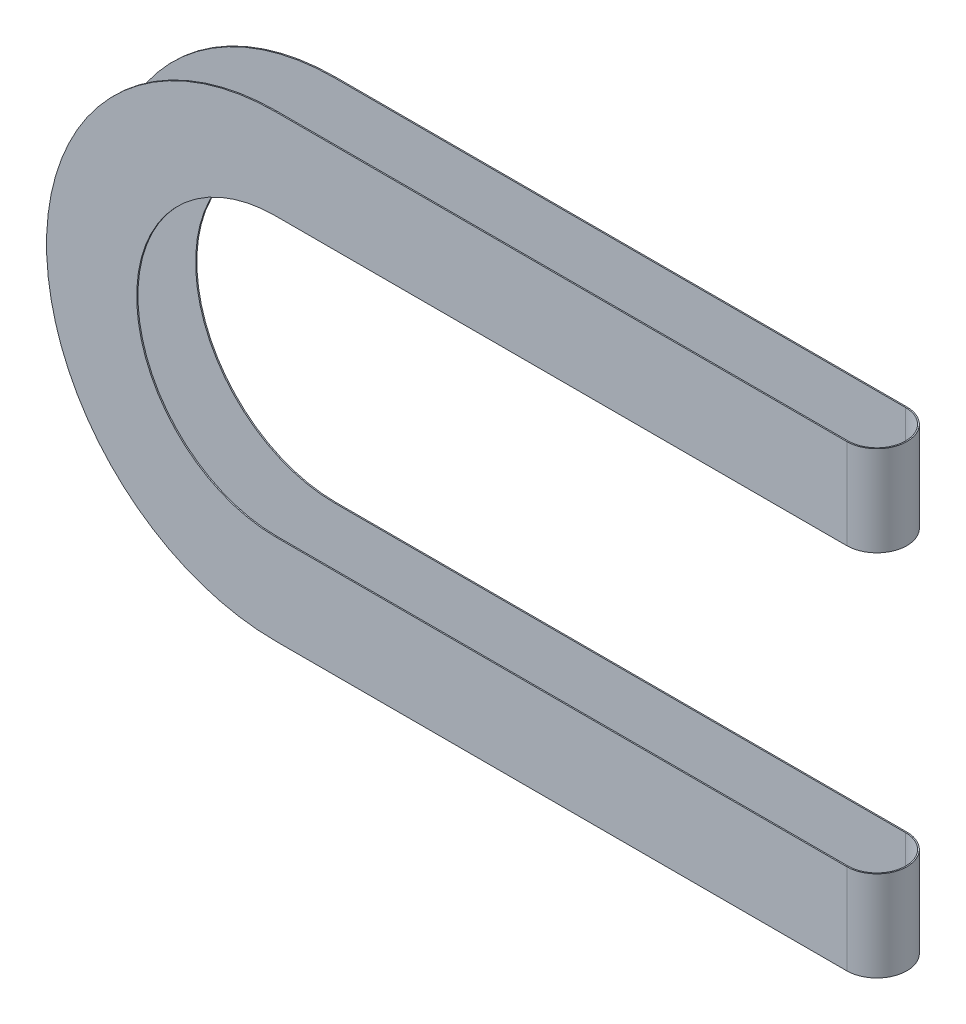
ISO-10303-21;
HEADER;
FILE_DESCRIPTION(('STEP AP214'),'2;1');
FILE_NAME('part.step','',(''),(''),'','','');
FILE_SCHEMA(('AUTOMOTIVE_DESIGN { 1 0 10303 214 1 1 1 1 }'));
ENDSEC;
DATA;
#1=APPLICATION_CONTEXT('core data for automotive mechanical design processes');
#2=APPLICATION_PROTOCOL_DEFINITION('international standard','automotive_design',2000,#1);
#3=PRODUCT_CONTEXT('',#1,'mechanical');
#4=PRODUCT('Part','Part','',(#3));
#5=PRODUCT_RELATED_PRODUCT_CATEGORY('part','',(#4));
#6=PRODUCT_DEFINITION_FORMATION('','',#4);
#7=PRODUCT_DEFINITION_CONTEXT('part definition',#1,'design');
#8=PRODUCT_DEFINITION('design','',#6,#7);
#9=PRODUCT_DEFINITION_SHAPE('','',#8);
#10=(LENGTH_UNIT() NAMED_UNIT(*) SI_UNIT(.MILLI.,.METRE.));
#11=(NAMED_UNIT(*) PLANE_ANGLE_UNIT() SI_UNIT($,.RADIAN.));
#12=(NAMED_UNIT(*) SI_UNIT($,.STERADIAN.) SOLID_ANGLE_UNIT());
#13=UNCERTAINTY_MEASURE_WITH_UNIT(LENGTH_MEASURE(1.E-05),#10,'distance_accuracy_value','');
#14=(GEOMETRIC_REPRESENTATION_CONTEXT(3) GLOBAL_UNCERTAINTY_ASSIGNED_CONTEXT((#13)) GLOBAL_UNIT_ASSIGNED_CONTEXT((#10,
#11,#12)) REPRESENTATION_CONTEXT('',''));
#15=CARTESIAN_POINT('',(0.,0.,0.));
#16=DIRECTION('',(0.,0.,1.));
#17=DIRECTION('',(1.,0.,0.));
#18=AXIS2_PLACEMENT_3D('',#15,#16,#17);
#19=CARTESIAN_POINT('',(0.,-381.25,100.));
#20=DIRECTION('',(0.,1.,0.));
#21=DIRECTION('',(-1.,0.,0.));
#22=AXIS2_PLACEMENT_3D('',#19,#20,#21);
#23=PLANE('',#22);
#24=DIRECTION('',(1.,0.,0.));
#25=VECTOR('',#24,1.);
#26=CARTESIAN_POINT('',(0.,-381.25,0.));
#27=LINE('',#26,#25);
#28=CARTESIAN_POINT('',(0.,-381.25,0.));
#29=VERTEX_POINT('',#28);
#30=CARTESIAN_POINT('',(950.,-381.25,0.));
#31=VERTEX_POINT('',#30);
#32=EDGE_CURVE('E231',#29,#31,#27,.T.);
#33=ORIENTED_EDGE('',*,*,#32,.T.);
#34=CARTESIAN_POINT('',(950.,-381.25,50.0000000000004));
#35=DIRECTION('',(0.,-1.,0.));
#36=DIRECTION('',(1.,0.,0.));
#37=AXIS2_PLACEMENT_3D('',#34,#35,#36);
#38=CIRCLE('',#37,50.);
#39=CARTESIAN_POINT('',(950.,-381.25,100.));
#40=VERTEX_POINT('',#39);
#41=EDGE_CURVE('E214',#31,#40,#38,.T.);
#42=ORIENTED_EDGE('',*,*,#41,.T.);
#43=DIRECTION('',(1.,0.,0.));
#44=VECTOR('',#43,1.);
#45=CARTESIAN_POINT('',(0.,-381.25,100.));
#46=LINE('',#45,#44);
#47=CARTESIAN_POINT('',(0.,-381.25,100.));
#48=VERTEX_POINT('',#47);
#49=EDGE_CURVE('E259',#48,#40,#46,.T.);
#50=ORIENTED_EDGE('',*,*,#49,.F.);
#51=DIRECTION('',(0.,0.,-1.));
#52=VECTOR('',#51,1.);
#53=CARTESIAN_POINT('',(0.,-381.25,100.));
#54=LINE('',#53,#52);
#55=CARTESIAN_POINT('',(0.,-381.25,98.0000000000003));
#56=VERTEX_POINT('',#55);
#57=EDGE_CURVE('E260',#48,#56,#54,.T.);
#58=ORIENTED_EDGE('',*,*,#57,.T.);
#59=DIRECTION('',(1.,0.,0.));
#60=VECTOR('',#59,1.);
#61=CARTESIAN_POINT('',(0.,-381.25,98.0000000000003));
#62=LINE('',#61,#60);
#63=CARTESIAN_POINT('',(950.,-381.25,98.0000000000008));
#64=VERTEX_POINT('',#63);
#65=EDGE_CURVE('E349',#56,#64,#62,.T.);
#66=ORIENTED_EDGE('',*,*,#65,.T.);
#67=CARTESIAN_POINT('',(950.,-381.25,50.0000000000004));
#68=DIRECTION('',(0.,-1.,0.));
#69=DIRECTION('',(1.,0.,0.));
#70=AXIS2_PLACEMENT_3D('',#67,#68,#69);
#71=CIRCLE('',#70,48.);
#72=CARTESIAN_POINT('',(950.,-381.25,2.));
#73=VERTEX_POINT('',#72);
#74=EDGE_CURVE('E353',#73,#64,#71,.T.);
#75=ORIENTED_EDGE('',*,*,#74,.F.);
#76=DIRECTION('',(1.,0.,0.));
#77=VECTOR('',#76,1.);
#78=CARTESIAN_POINT('',(0.,-381.25,2.));
#79=LINE('',#78,#77);
#80=CARTESIAN_POINT('',(0.,-381.25,2.));
#81=VERTEX_POINT('',#80);
#82=EDGE_CURVE('E224',#81,#73,#79,.T.);
#83=ORIENTED_EDGE('',*,*,#82,.F.);
#84=EDGE_CURVE('E239',#81,#29,#54,.T.);
#85=ORIENTED_EDGE('',*,*,#84,.T.);
#86=EDGE_LOOP('',(#33,#42,#50,#58,#66,#75,#83,#85));
#87=FACE_BOUND('',#86,.T.);
#88=ADVANCED_FACE('F102',(#87),#23,.F.);
#89=CARTESIAN_POINT('',(0.,-231.25,100.));
#90=DIRECTION('',(0.,1.,0.));
#91=DIRECTION('',(-1.,0.,0.));
#92=AXIS2_PLACEMENT_3D('',#89,#90,#91);
#93=PLANE('',#92);
#94=CARTESIAN_POINT('',(950.,-231.25,50.0000000000004));
#95=DIRECTION('',(0.,1.,0.));
#96=DIRECTION('',(-1.,0.,0.));
#97=AXIS2_PLACEMENT_3D('',#94,#95,#96);
#98=CIRCLE('',#97,50.);
#99=CARTESIAN_POINT('',(950.,-231.25,100.));
#100=VERTEX_POINT('',#99);
#101=CARTESIAN_POINT('',(950.,-231.25,0.));
#102=VERTEX_POINT('',#101);
#103=EDGE_CURVE('E300',#100,#102,#98,.T.);
#104=ORIENTED_EDGE('',*,*,#103,.T.);
#105=DIRECTION('',(1.,0.,0.));
#106=VECTOR('',#105,1.);
#107=CARTESIAN_POINT('',(0.,-231.25,0.));
#108=LINE('',#107,#106);
#109=CARTESIAN_POINT('',(0.,-231.25,0.));
#110=VERTEX_POINT('',#109);
#111=EDGE_CURVE('E235',#110,#102,#108,.T.);
#112=ORIENTED_EDGE('',*,*,#111,.F.);
#113=DIRECTION('',(0.,0.,-1.));
#114=VECTOR('',#113,1.);
#115=CARTESIAN_POINT('',(0.,-231.25,100.));
#116=LINE('',#115,#114);
#117=CARTESIAN_POINT('',(0.,-231.25,2.));
#118=VERTEX_POINT('',#117);
#119=EDGE_CURVE('E271',#118,#110,#116,.T.);
#120=ORIENTED_EDGE('',*,*,#119,.F.);
#121=DIRECTION('',(-1.,0.,0.));
#122=VECTOR('',#121,1.);
#123=CARTESIAN_POINT('',(0.,-231.25,2.));
#124=LINE('',#123,#122);
#125=CARTESIAN_POINT('',(950.,-231.25,2.));
#126=VERTEX_POINT('',#125);
#127=EDGE_CURVE('E308',#126,#118,#124,.T.);
#128=ORIENTED_EDGE('',*,*,#127,.F.);
#129=CARTESIAN_POINT('',(950.,-231.25,50.0000000000004));
#130=DIRECTION('',(0.,1.,0.));
#131=DIRECTION('',(-1.,0.,0.));
#132=AXIS2_PLACEMENT_3D('',#129,#130,#131);
#133=CIRCLE('',#132,48.);
#134=CARTESIAN_POINT('',(950.,-231.25,98.0000000000008));
#135=VERTEX_POINT('',#134);
#136=EDGE_CURVE('E240',#135,#126,#133,.T.);
#137=ORIENTED_EDGE('',*,*,#136,.F.);
#138=DIRECTION('',(-1.,0.,0.));
#139=VECTOR('',#138,1.);
#140=CARTESIAN_POINT('',(0.,-231.25,98.0000000000003));
#141=LINE('',#140,#139);
#142=CARTESIAN_POINT('',(0.,-231.25,98.0000000000003));
#143=VERTEX_POINT('',#142);
#144=EDGE_CURVE('E316',#135,#143,#141,.T.);
#145=ORIENTED_EDGE('',*,*,#144,.T.);
#146=CARTESIAN_POINT('',(0.,-231.25,100.));
#147=VERTEX_POINT('',#146);
#148=EDGE_CURVE('E272',#147,#143,#116,.T.);
#149=ORIENTED_EDGE('',*,*,#148,.F.);
#150=DIRECTION('',(1.,0.,0.));
#151=VECTOR('',#150,1.);
#152=CARTESIAN_POINT('',(0.,-231.25,100.));
#153=LINE('',#152,#151);
#154=EDGE_CURVE('E321',#147,#100,#153,.T.);
#155=ORIENTED_EDGE('',*,*,#154,.T.);
#156=EDGE_LOOP('',(#104,#112,#120,#128,#137,#145,#149,#155));
#157=FACE_BOUND('',#156,.T.);
#158=ADVANCED_FACE('F365',(#157),#93,.T.);
#159=CARTESIAN_POINT('',(0.,231.25,100.));
#160=DIRECTION('',(0.,1.,0.));
#161=DIRECTION('',(-1.,0.,0.));
#162=AXIS2_PLACEMENT_3D('',#159,#160,#161);
#163=PLANE('',#162);
#164=DIRECTION('',(1.,0.,0.));
#165=VECTOR('',#164,1.);
#166=CARTESIAN_POINT('',(0.,231.25,0.));
#167=LINE('',#166,#165);
#168=CARTESIAN_POINT('',(0.,231.25,0.));
#169=VERTEX_POINT('',#168);
#170=CARTESIAN_POINT('',(950.,231.25,0.));
#171=VERTEX_POINT('',#170);
#172=EDGE_CURVE('E252',#169,#171,#167,.T.);
#173=ORIENTED_EDGE('',*,*,#172,.T.);
#174=CARTESIAN_POINT('',(950.,231.25,50.0000000000004));
#175=DIRECTION('',(0.,1.,0.));
#176=DIRECTION('',(-1.,0.,0.));
#177=AXIS2_PLACEMENT_3D('',#174,#175,#176);
#178=CIRCLE('',#177,50.);
#179=CARTESIAN_POINT('',(950.,231.25,100.));
#180=VERTEX_POINT('',#179);
#181=EDGE_CURVE('E303',#180,#171,#178,.T.);
#182=ORIENTED_EDGE('',*,*,#181,.F.);
#183=DIRECTION('',(1.,0.,0.));
#184=VECTOR('',#183,1.);
#185=CARTESIAN_POINT('',(0.,231.25,100.));
#186=LINE('',#185,#184);
#187=CARTESIAN_POINT('',(0.,231.25,100.));
#188=VERTEX_POINT('',#187);
#189=EDGE_CURVE('E326',#188,#180,#186,.T.);
#190=ORIENTED_EDGE('',*,*,#189,.F.);
#191=DIRECTION('',(0.,0.,-1.));
#192=VECTOR('',#191,1.);
#193=CARTESIAN_POINT('',(0.,231.25,100.));
#194=LINE('',#193,#192);
#195=CARTESIAN_POINT('',(0.,231.25,98.0000000000003));
#196=VERTEX_POINT('',#195);
#197=EDGE_CURVE('E268',#188,#196,#194,.T.);
#198=ORIENTED_EDGE('',*,*,#197,.T.);
#199=DIRECTION('',(-1.,0.,0.));
#200=VECTOR('',#199,1.);
#201=CARTESIAN_POINT('',(0.,231.25,98.0000000000003));
#202=LINE('',#201,#200);
#203=CARTESIAN_POINT('',(950.,231.25,98.0000000000008));
#204=VERTEX_POINT('',#203);
#205=EDGE_CURVE('E312',#204,#196,#202,.T.);
#206=ORIENTED_EDGE('',*,*,#205,.F.);
#207=CARTESIAN_POINT('',(950.,231.25,50.0000000000004));
#208=DIRECTION('',(0.,1.,0.));
#209=DIRECTION('',(-1.,0.,0.));
#210=AXIS2_PLACEMENT_3D('',#207,#208,#209);
#211=CIRCLE('',#210,48.);
#212=CARTESIAN_POINT('',(950.,231.25,2.));
#213=VERTEX_POINT('',#212);
#214=EDGE_CURVE('E244',#204,#213,#211,.T.);
#215=ORIENTED_EDGE('',*,*,#214,.T.);
#216=DIRECTION('',(-1.,0.,0.));
#217=VECTOR('',#216,1.);
#218=CARTESIAN_POINT('',(0.,231.25,2.));
#219=LINE('',#218,#217);
#220=CARTESIAN_POINT('',(0.,231.25,2.));
#221=VERTEX_POINT('',#220);
#222=EDGE_CURVE('E293',#213,#221,#219,.T.);
#223=ORIENTED_EDGE('',*,*,#222,.T.);
#224=EDGE_CURVE('E267',#221,#169,#194,.T.);
#225=ORIENTED_EDGE('',*,*,#224,.T.);
#226=EDGE_LOOP('',(#173,#182,#190,#198,#206,#215,#223,#225));
#227=FACE_BOUND('',#226,.T.);
#228=ADVANCED_FACE('F345',(#227),#163,.F.);
#229=CARTESIAN_POINT('',(0.,381.25,100.));
#230=DIRECTION('',(0.,1.,0.));
#231=DIRECTION('',(-1.,0.,0.));
#232=AXIS2_PLACEMENT_3D('',#229,#230,#231);
#233=PLANE('',#232);
#234=CARTESIAN_POINT('',(950.,381.25,50.0000000000004));
#235=DIRECTION('',(0.,1.,0.));
#236=DIRECTION('',(-1.,0.,0.));
#237=AXIS2_PLACEMENT_3D('',#234,#235,#236);
#238=CIRCLE('',#237,50.);
#239=CARTESIAN_POINT('',(950.,381.25,100.));
#240=VERTEX_POINT('',#239);
#241=CARTESIAN_POINT('',(950.,381.25,0.));
#242=VERTEX_POINT('',#241);
#243=EDGE_CURVE('E343',#240,#242,#238,.T.);
#244=ORIENTED_EDGE('',*,*,#243,.T.);
#245=DIRECTION('',(1.,0.,0.));
#246=VECTOR('',#245,1.);
#247=CARTESIAN_POINT('',(0.,381.25,0.));
#248=LINE('',#247,#246);
#249=CARTESIAN_POINT('',(0.,381.25,0.));
#250=VERTEX_POINT('',#249);
#251=EDGE_CURVE('E255',#250,#242,#248,.T.);
#252=ORIENTED_EDGE('',*,*,#251,.F.);
#253=DIRECTION('',(0.,0.,-1.));
#254=VECTOR('',#253,1.);
#255=CARTESIAN_POINT('',(0.,381.25,100.));
#256=LINE('',#255,#254);
#257=CARTESIAN_POINT('',(0.,381.25,2.));
#258=VERTEX_POINT('',#257);
#259=EDGE_CURVE('E263',#258,#250,#256,.T.);
#260=ORIENTED_EDGE('',*,*,#259,.F.);
#261=DIRECTION('',(-1.,0.,0.));
#262=VECTOR('',#261,1.);
#263=CARTESIAN_POINT('',(0.,381.25,2.));
#264=LINE('',#263,#262);
#265=CARTESIAN_POINT('',(950.,381.25,2.));
#266=VERTEX_POINT('',#265);
#267=EDGE_CURVE('E123',#266,#258,#264,.T.);
#268=ORIENTED_EDGE('',*,*,#267,.F.);
#269=CARTESIAN_POINT('',(950.,381.25,50.0000000000004));
#270=DIRECTION('',(0.,1.,0.));
#271=DIRECTION('',(-1.,0.,0.));
#272=AXIS2_PLACEMENT_3D('',#269,#270,#271);
#273=CIRCLE('',#272,48.);
#274=CARTESIAN_POINT('',(950.,381.25,98.0000000000008));
#275=VERTEX_POINT('',#274);
#276=EDGE_CURVE('E236',#275,#266,#273,.T.);
#277=ORIENTED_EDGE('',*,*,#276,.F.);
#278=DIRECTION('',(-1.,0.,0.));
#279=VECTOR('',#278,1.);
#280=CARTESIAN_POINT('',(0.,381.25,98.0000000000003));
#281=LINE('',#280,#279);
#282=CARTESIAN_POINT('',(0.,381.25,98.0000000000003));
#283=VERTEX_POINT('',#282);
#284=EDGE_CURVE('E310',#275,#283,#281,.T.);
#285=ORIENTED_EDGE('',*,*,#284,.T.);
#286=CARTESIAN_POINT('',(0.,381.25,100.));
#287=VERTEX_POINT('',#286);
#288=EDGE_CURVE('E264',#287,#283,#256,.T.);
#289=ORIENTED_EDGE('',*,*,#288,.F.);
#290=DIRECTION('',(1.,0.,0.));
#291=VECTOR('',#290,1.);
#292=CARTESIAN_POINT('',(0.,381.25,100.));
#293=LINE('',#292,#291);
#294=EDGE_CURVE('E328',#287,#240,#293,.T.);
#295=ORIENTED_EDGE('',*,*,#294,.T.);
#296=EDGE_LOOP('',(#244,#252,#260,#268,#277,#285,#289,#295));
#297=FACE_BOUND('',#296,.T.);
#298=ADVANCED_FACE('F298',(#297),#233,.T.);
#299=CARTESIAN_POINT('',(0.,0.,100.));
#300=DIRECTION('',(0.,0.,-1.));
#301=DIRECTION('',(-1.,0.,0.));
#302=AXIS2_PLACEMENT_3D('',#299,#300,#301);
#303=CYLINDRICAL_SURFACE('',#302,231.25);
#304=CARTESIAN_POINT('',(0.,0.,98.0000000000003));
#305=DIRECTION('',(0.,0.,-1.));
#306=DIRECTION('',(-1.,0.,0.));
#307=AXIS2_PLACEMENT_3D('',#304,#305,#306);
#308=CIRCLE('',#307,231.25);
#309=EDGE_CURVE('E314',#196,#143,#308,.F.);
#310=ORIENTED_EDGE('',*,*,#309,.F.);
#311=ORIENTED_EDGE('',*,*,#197,.F.);
#312=CARTESIAN_POINT('',(0.,0.,100.));
#313=DIRECTION('',(0.,0.,1.));
#314=DIRECTION('',(1.,0.,0.));
#315=AXIS2_PLACEMENT_3D('',#312,#313,#314);
#316=CIRCLE('',#315,231.25);
#317=EDGE_CURVE('E324',#147,#188,#316,.F.);
#318=ORIENTED_EDGE('',*,*,#317,.F.);
#319=ORIENTED_EDGE('',*,*,#148,.T.);
#320=EDGE_LOOP('',(#310,#311,#318,#319));
#321=FACE_BOUND('',#320,.T.);
#322=ADVANCED_FACE('F376',(#321),#303,.F.);
#323=CARTESIAN_POINT('',(0.,0.,100.));
#324=DIRECTION('',(0.,0.,-1.));
#325=DIRECTION('',(-1.,0.,0.));
#326=AXIS2_PLACEMENT_3D('',#323,#324,#325);
#327=CYLINDRICAL_SURFACE('',#326,381.25);
#328=ORIENTED_EDGE('',*,*,#288,.T.);
#329=CARTESIAN_POINT('',(0.,0.,98.0000000000003));
#330=DIRECTION('',(0.,0.,-1.));
#331=DIRECTION('',(-1.,0.,0.));
#332=AXIS2_PLACEMENT_3D('',#329,#330,#331);
#333=CIRCLE('',#332,381.25);
#334=EDGE_CURVE('E279',#283,#56,#333,.F.);
#335=ORIENTED_EDGE('',*,*,#334,.T.);
#336=ORIENTED_EDGE('',*,*,#57,.F.);
#337=CARTESIAN_POINT('',(0.,0.,100.));
#338=DIRECTION('',(0.,0.,1.));
#339=DIRECTION('',(1.,0.,0.));
#340=AXIS2_PLACEMENT_3D('',#337,#338,#339);
#341=CIRCLE('',#340,381.25);
#342=EDGE_CURVE('E247',#48,#287,#341,.F.);
#343=ORIENTED_EDGE('',*,*,#342,.T.);
#344=EDGE_LOOP('',(#328,#335,#336,#343));
#345=FACE_BOUND('',#344,.T.);
#346=ADVANCED_FACE('F334',(#345),#327,.T.);
#347=ORIENTED_EDGE('',*,*,#224,.F.);
#348=CARTESIAN_POINT('',(0.,0.,2.));
#349=DIRECTION('',(0.,0.,-1.));
#350=DIRECTION('',(-1.,0.,0.));
#351=AXIS2_PLACEMENT_3D('',#348,#349,#350);
#352=CIRCLE('',#351,231.25);
#353=EDGE_CURVE('E116',#221,#118,#352,.F.);
#354=ORIENTED_EDGE('',*,*,#353,.T.);
#355=ORIENTED_EDGE('',*,*,#119,.T.);
#356=CARTESIAN_POINT('',(0.,0.,0.));
#357=DIRECTION('',(0.,0.,1.));
#358=DIRECTION('',(1.,0.,0.));
#359=AXIS2_PLACEMENT_3D('',#356,#357,#358);
#360=CIRCLE('',#359,231.25);
#361=EDGE_CURVE('E242',#110,#169,#360,.F.);
#362=ORIENTED_EDGE('',*,*,#361,.T.);
#363=EDGE_LOOP('',(#347,#354,#355,#362));
#364=FACE_BOUND('',#363,.T.);
#365=ADVANCED_FACE('F369',(#364),#303,.F.);
#366=CARTESIAN_POINT('',(0.,0.,2.));
#367=DIRECTION('',(0.,0.,-1.));
#368=DIRECTION('',(-1.,0.,0.));
#369=AXIS2_PLACEMENT_3D('',#366,#367,#368);
#370=CIRCLE('',#369,381.25);
#371=EDGE_CURVE('E277',#258,#81,#370,.F.);
#372=ORIENTED_EDGE('',*,*,#371,.F.);
#373=ORIENTED_EDGE('',*,*,#259,.T.);
#374=CARTESIAN_POINT('',(0.,0.,0.));
#375=DIRECTION('',(0.,0.,1.));
#376=DIRECTION('',(1.,0.,0.));
#377=AXIS2_PLACEMENT_3D('',#374,#375,#376);
#378=CIRCLE('',#377,381.25);
#379=EDGE_CURVE('E257',#29,#250,#378,.F.);
#380=ORIENTED_EDGE('',*,*,#379,.F.);
#381=ORIENTED_EDGE('',*,*,#84,.F.);
#382=EDGE_LOOP('',(#372,#373,#380,#381));
#383=FACE_BOUND('',#382,.T.);
#384=ADVANCED_FACE('F386',(#383),#327,.T.);
#385=CARTESIAN_POINT('',(0.,0.,100.));
#386=DIRECTION('',(0.,0.,1.));
#387=DIRECTION('',(1.,0.,0.));
#388=AXIS2_PLACEMENT_3D('',#385,#386,#387);
#389=PLANE('',#388);
#390=DIRECTION('',(0.,-1.,0.));
#391=VECTOR('',#390,1.);
#392=CARTESIAN_POINT('',(950.,618.75,100.));
#393=LINE('',#392,#391);
#394=EDGE_CURVE('E276',#240,#180,#393,.T.);
#395=ORIENTED_EDGE('',*,*,#394,.F.);
#396=ORIENTED_EDGE('',*,*,#294,.F.);
#397=ORIENTED_EDGE('',*,*,#342,.F.);
#398=ORIENTED_EDGE('',*,*,#49,.T.);
#399=EDGE_CURVE('E219',#100,#40,#393,.T.);
#400=ORIENTED_EDGE('',*,*,#399,.F.);
#401=ORIENTED_EDGE('',*,*,#154,.F.);
#402=ORIENTED_EDGE('',*,*,#317,.T.);
#403=ORIENTED_EDGE('',*,*,#189,.T.);
#404=EDGE_LOOP('',(#395,#396,#397,#398,#400,#401,#402,#403));
#405=FACE_BOUND('',#404,.T.);
#406=ADVANCED_FACE('F337',(#405),#389,.T.);
#407=CARTESIAN_POINT('',(0.,0.,0.));
#408=DIRECTION('',(0.,0.,1.));
#409=DIRECTION('',(1.,0.,0.));
#410=AXIS2_PLACEMENT_3D('',#407,#408,#409);
#411=PLANE('',#410);
#412=ORIENTED_EDGE('',*,*,#251,.T.);
#413=DIRECTION('',(0.,-1.,0.));
#414=VECTOR('',#413,1.);
#415=CARTESIAN_POINT('',(950.,618.75,1.87350135405495E-13));
#416=LINE('',#415,#414);
#417=EDGE_CURVE('E12',#242,#171,#416,.T.);
#418=ORIENTED_EDGE('',*,*,#417,.T.);
#419=ORIENTED_EDGE('',*,*,#172,.F.);
#420=ORIENTED_EDGE('',*,*,#361,.F.);
#421=ORIENTED_EDGE('',*,*,#111,.T.);
#422=EDGE_CURVE('E105',#102,#31,#416,.T.);
#423=ORIENTED_EDGE('',*,*,#422,.T.);
#424=ORIENTED_EDGE('',*,*,#32,.F.);
#425=ORIENTED_EDGE('',*,*,#379,.T.);
#426=EDGE_LOOP('',(#412,#418,#419,#420,#421,#423,#424,#425));
#427=FACE_BOUND('',#426,.T.);
#428=ADVANCED_FACE('F229',(#427),#411,.F.);
#429=CARTESIAN_POINT('',(950.,618.75,50.0000000000004));
#430=DIRECTION('',(0.,-1.,0.));
#431=DIRECTION('',(1.,0.,0.));
#432=AXIS2_PLACEMENT_3D('',#429,#430,#431);
#433=CYLINDRICAL_SURFACE('',#432,50.);
#434=ORIENTED_EDGE('',*,*,#399,.T.);
#435=ORIENTED_EDGE('',*,*,#41,.F.);
#436=ORIENTED_EDGE('',*,*,#422,.F.);
#437=ORIENTED_EDGE('',*,*,#103,.F.);
#438=EDGE_LOOP('',(#434,#435,#436,#437));
#439=FACE_BOUND('',#438,.T.);
#440=ADVANCED_FACE('F216',(#439),#433,.T.);
#441=ORIENTED_EDGE('',*,*,#181,.T.);
#442=ORIENTED_EDGE('',*,*,#417,.F.);
#443=ORIENTED_EDGE('',*,*,#243,.F.);
#444=ORIENTED_EDGE('',*,*,#394,.T.);
#445=EDGE_LOOP('',(#441,#442,#443,#444));
#446=FACE_BOUND('',#445,.T.);
#447=ADVANCED_FACE('F341',(#446),#433,.T.);
#448=CARTESIAN_POINT('',(950.,618.75,50.0000000000004));
#449=DIRECTION('',(0.,-1.,0.));
#450=DIRECTION('',(1.,0.,0.));
#451=AXIS2_PLACEMENT_3D('',#448,#449,#450);
#452=CYLINDRICAL_SURFACE('',#451,48.);
#453=DIRECTION('',(0.,-1.,0.));
#454=VECTOR('',#453,1.);
#455=CARTESIAN_POINT('',(950.,618.75,98.0000000000008));
#456=LINE('',#455,#454);
#457=EDGE_CURVE('E289',#275,#204,#456,.T.);
#458=ORIENTED_EDGE('',*,*,#457,.F.);
#459=ORIENTED_EDGE('',*,*,#276,.T.);
#460=DIRECTION('',(0.,-1.,0.));
#461=VECTOR('',#460,1.);
#462=CARTESIAN_POINT('',(950.,618.75,2.));
#463=LINE('',#462,#461);
#464=EDGE_CURVE('E286',#266,#213,#463,.T.);
#465=ORIENTED_EDGE('',*,*,#464,.T.);
#466=ORIENTED_EDGE('',*,*,#214,.F.);
#467=EDGE_LOOP('',(#458,#459,#465,#466));
#468=FACE_BOUND('',#467,.T.);
#469=ADVANCED_FACE('F285',(#468),#452,.F.);
#470=CARTESIAN_POINT('',(0.,618.75,98.0000000000003));
#471=DIRECTION('',(0.,0.,-1.));
#472=DIRECTION('',(-1.,0.,0.));
#473=AXIS2_PLACEMENT_3D('',#470,#471,#472);
#474=PLANE('',#473);
#475=EDGE_CURVE('E294',#135,#64,#456,.T.);
#476=ORIENTED_EDGE('',*,*,#475,.T.);
#477=ORIENTED_EDGE('',*,*,#65,.F.);
#478=ORIENTED_EDGE('',*,*,#334,.F.);
#479=ORIENTED_EDGE('',*,*,#284,.F.);
#480=ORIENTED_EDGE('',*,*,#457,.T.);
#481=ORIENTED_EDGE('',*,*,#205,.T.);
#482=ORIENTED_EDGE('',*,*,#309,.T.);
#483=ORIENTED_EDGE('',*,*,#144,.F.);
#484=EDGE_LOOP('',(#476,#477,#478,#479,#480,#481,#482,#483));
#485=FACE_BOUND('',#484,.T.);
#486=ADVANCED_FACE('F372',(#485),#474,.T.);
#487=ORIENTED_EDGE('',*,*,#136,.T.);
#488=EDGE_CURVE('E295',#126,#73,#463,.T.);
#489=ORIENTED_EDGE('',*,*,#488,.T.);
#490=ORIENTED_EDGE('',*,*,#74,.T.);
#491=ORIENTED_EDGE('',*,*,#475,.F.);
#492=EDGE_LOOP('',(#487,#489,#490,#491));
#493=FACE_BOUND('',#492,.T.);
#494=ADVANCED_FACE('F362',(#493),#452,.F.);
#495=CARTESIAN_POINT('',(0.,618.75,2.));
#496=DIRECTION('',(0.,0.,-1.));
#497=DIRECTION('',(-1.,0.,0.));
#498=AXIS2_PLACEMENT_3D('',#495,#496,#497);
#499=PLANE('',#498);
#500=ORIENTED_EDGE('',*,*,#127,.T.);
#501=ORIENTED_EDGE('',*,*,#353,.F.);
#502=ORIENTED_EDGE('',*,*,#222,.F.);
#503=ORIENTED_EDGE('',*,*,#464,.F.);
#504=ORIENTED_EDGE('',*,*,#267,.T.);
#505=ORIENTED_EDGE('',*,*,#371,.T.);
#506=ORIENTED_EDGE('',*,*,#82,.T.);
#507=ORIENTED_EDGE('',*,*,#488,.F.);
#508=EDGE_LOOP('',(#500,#501,#502,#503,#504,#505,#506,#507));
#509=FACE_BOUND('',#508,.T.);
#510=ADVANCED_FACE('F292',(#509),#499,.F.);
#511=CLOSED_SHELL('',(#88,#158,#228,#298,#322,#346,#365,#384,#406,#428,#440,#447,#469,#486,#494,#510));
#512=MANIFOLD_SOLID_BREP('B2',#511);
#513=ADVANCED_BREP_SHAPE_REPRESENTATION('',(#18,#512),#14);
#514=SHAPE_DEFINITION_REPRESENTATION(#9,#513);
ENDSEC;
END-ISO-10303-21;
